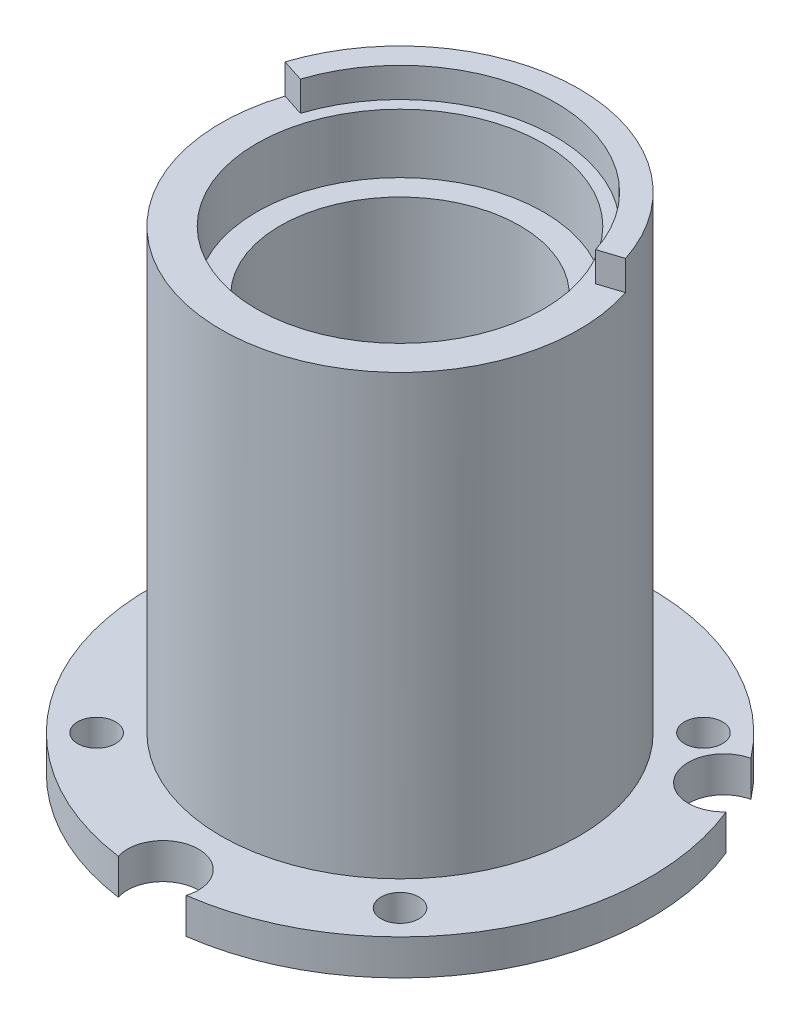
ISO-10303-21;
HEADER;
FILE_DESCRIPTION(('STEP AP214'),'2;1');
FILE_NAME('part.step','',(''),(''),'','','');
FILE_SCHEMA(('AUTOMOTIVE_DESIGN { 1 0 10303 214 1 1 1 1 }'));
ENDSEC;
DATA;
#1=APPLICATION_CONTEXT('core data for automotive mechanical design processes');
#2=APPLICATION_PROTOCOL_DEFINITION('international standard','automotive_design',2000,#1);
#3=PRODUCT_CONTEXT('',#1,'mechanical');
#4=PRODUCT('Part','Part','',(#3));
#5=PRODUCT_RELATED_PRODUCT_CATEGORY('part','',(#4));
#6=PRODUCT_DEFINITION_FORMATION('','',#4);
#7=PRODUCT_DEFINITION_CONTEXT('part definition',#1,'design');
#8=PRODUCT_DEFINITION('design','',#6,#7);
#9=PRODUCT_DEFINITION_SHAPE('','',#8);
#10=(LENGTH_UNIT() NAMED_UNIT(*) SI_UNIT(.MILLI.,.METRE.));
#11=(NAMED_UNIT(*) PLANE_ANGLE_UNIT() SI_UNIT($,.RADIAN.));
#12=(NAMED_UNIT(*) SI_UNIT($,.STERADIAN.) SOLID_ANGLE_UNIT());
#13=UNCERTAINTY_MEASURE_WITH_UNIT(LENGTH_MEASURE(1.E-05),#10,'distance_accuracy_value','');
#14=(GEOMETRIC_REPRESENTATION_CONTEXT(3) GLOBAL_UNCERTAINTY_ASSIGNED_CONTEXT((#13)) GLOBAL_UNIT_ASSIGNED_CONTEXT((#10,
#11,#12)) REPRESENTATION_CONTEXT('',''));
#15=CARTESIAN_POINT('',(0.,0.,0.));
#16=DIRECTION('',(0.,0.,1.));
#17=DIRECTION('',(1.,0.,0.));
#18=AXIS2_PLACEMENT_3D('',#15,#16,#17);
#19=CARTESIAN_POINT('',(0.,2.65658402047803,0.));
#20=DIRECTION('',(0.,-1.,0.));
#21=DIRECTION('',(0.,0.,-1.));
#22=AXIS2_PLACEMENT_3D('',#19,#20,#21);
#23=CYLINDRICAL_SURFACE('',#22,21.1);
#24=DIRECTION('',(0.,-1.,0.));
#25=VECTOR('',#24,1.);
#26=CARTESIAN_POINT('',(19.53455820284,1.15658402047804,-7.97565268926972));
#27=LINE('',#26,#25);
#28=CARTESIAN_POINT('',(19.53455820284,2.65658402047803,-7.97565268926972));
#29=VERTEX_POINT('',#28);
#30=CARTESIAN_POINT('',(19.53455820284,-0.343415979521965,-7.97565268926972));
#31=VERTEX_POINT('',#30);
#32=EDGE_CURVE('E225',#29,#31,#27,.T.);
#33=ORIENTED_EDGE('',*,*,#32,.F.);
#34=CARTESIAN_POINT('',(0.,2.65658402047803,0.));
#35=DIRECTION('',(0.,-1.,0.));
#36=DIRECTION('',(0.,0.,-1.));
#37=AXIS2_PLACEMENT_3D('',#34,#35,#36);
#38=CIRCLE('',#37,21.1);
#39=CARTESIAN_POINT('',(2.86016126075087,2.65658402047803,20.90525));
#40=VERTEX_POINT('',#39);
#41=EDGE_CURVE('E238',#29,#40,#38,.T.);
#42=ORIENTED_EDGE('',*,*,#41,.T.);
#43=DIRECTION('',(0.,-1.,0.));
#44=VECTOR('',#43,1.);
#45=CARTESIAN_POINT('',(2.86016126075087,1.15658402047804,20.90525));
#46=LINE('',#45,#44);
#47=CARTESIAN_POINT('',(2.86016126075087,-0.343415979521965,20.90525));
#48=VERTEX_POINT('',#47);
#49=EDGE_CURVE('E317',#48,#40,#46,.F.);
#50=ORIENTED_EDGE('',*,*,#49,.F.);
#51=CARTESIAN_POINT('',(0.,-0.343415979521965,0.));
#52=DIRECTION('',(0.,-1.,0.));
#53=DIRECTION('',(0.,0.,-1.));
#54=AXIS2_PLACEMENT_3D('',#51,#52,#53);
#55=CIRCLE('',#54,21.1);
#56=EDGE_CURVE('E236',#31,#48,#55,.T.);
#57=ORIENTED_EDGE('',*,*,#56,.F.);
#58=EDGE_LOOP('',(#33,#42,#50,#57));
#59=FACE_BOUND('',#58,.T.);
#60=ADVANCED_FACE('F36',(#59),#23,.T.);
#61=DIRECTION('',(0.,-1.,0.));
#62=VECTOR('',#61,1.);
#63=CARTESIAN_POINT('',(16.6743969420891,1.15658402047804,-12.9295973107305));
#64=LINE('',#63,#62);
#65=CARTESIAN_POINT('',(16.6743969420892,-0.343415979521965,-12.9295973107305));
#66=VERTEX_POINT('',#65);
#67=CARTESIAN_POINT('',(16.6743969420891,2.65658402047803,-12.9295973107305));
#68=VERTEX_POINT('',#67);
#69=EDGE_CURVE('E64',#66,#68,#64,.F.);
#70=ORIENTED_EDGE('',*,*,#69,.F.);
#71=CARTESIAN_POINT('',(-16.6743969420893,-0.343415979521965,-12.9295973107302));
#72=VERTEX_POINT('',#71);
#73=EDGE_CURVE('E222',#72,#66,#55,.T.);
#74=ORIENTED_EDGE('',*,*,#73,.F.);
#75=DIRECTION('',(0.,-1.,0.));
#76=VECTOR('',#75,1.);
#77=CARTESIAN_POINT('',(-16.6743969420893,1.15658402047804,-12.9295973107302));
#78=LINE('',#77,#76);
#79=CARTESIAN_POINT('',(-16.6743969420893,2.65658402047803,-12.9295973107302));
#80=VERTEX_POINT('',#79);
#81=EDGE_CURVE('E226',#80,#72,#78,.T.);
#82=ORIENTED_EDGE('',*,*,#81,.F.);
#83=EDGE_CURVE('E224',#80,#68,#38,.T.);
#84=ORIENTED_EDGE('',*,*,#83,.T.);
#85=EDGE_LOOP('',(#70,#74,#82,#84));
#86=FACE_BOUND('',#85,.T.);
#87=ADVANCED_FACE('F203',(#86),#23,.T.);
#88=CARTESIAN_POINT('',(0.,0.,0.));
#89=DIRECTION('',(0.,-1.,0.));
#90=DIRECTION('',(0.,0.,-1.));
#91=AXIS2_PLACEMENT_3D('',#88,#89,#90);
#92=CYLINDRICAL_SURFACE('',#91,15.1);
#93=CARTESIAN_POINT('',(0.,17.656584020478,-15.1));
#94=CARTESIAN_POINT('',(0.220562797228868,17.6565786750489,-15.0999966238633));
#95=CARTESIAN_POINT('',(0.441183132483683,17.6382798567774,-15.0951198010396));
#96=CARTESIAN_POINT('',(0.876071891674732,17.5656954460356,-15.0761386958318));
#97=CARTESIAN_POINT('',(1.09033714607183,17.5113922018138,-15.0620298873621));
#98=CARTESIAN_POINT('',(1.50617514769826,17.3686856431298,-15.0261426046077));
#99=CARTESIAN_POINT('',(1.70776375601984,17.2803259691262,-15.0043739488702));
#100=CARTESIAN_POINT('',(2.09326016244452,17.0721756463823,-14.9554694616101));
#101=CARTESIAN_POINT('',(2.27716684335126,16.9523830133957,-14.9283332912829));
#102=CARTESIAN_POINT('',(2.62629153686223,16.6818700668203,-14.8709302979056));
#103=CARTESIAN_POINT('',(2.7910468166787,16.5305637715842,-14.8406105216336));
#104=CARTESIAN_POINT('',(3.09316565387521,16.2025713913734,-14.7805988328791));
#105=CARTESIAN_POINT('',(3.23052573401469,16.0258820894538,-14.750907000528));
#106=CARTESIAN_POINT('',(3.47620253809525,15.6484566248968,-14.6949722039674));
#107=CARTESIAN_POINT('',(3.58398852405205,15.4473641730804,-14.6687960949846));
#108=CARTESIAN_POINT('',(3.76403958813345,15.0291063939305,-14.6236343764678));
#109=CARTESIAN_POINT('',(3.83631112002396,14.8119439951225,-14.6046474606416));
#110=CARTESIAN_POINT('',(3.94167778715528,14.3728315428059,-14.576560340708));
#111=CARTESIAN_POINT('',(3.97561113415321,14.1510964552699,-14.5672489746836));
#112=CARTESIAN_POINT('',(4.00595118006536,13.7049003167139,-14.5589362032035));
#113=CARTESIAN_POINT('',(4.00236479083902,13.4804397753848,-14.5599328988036));
#114=CARTESIAN_POINT('',(3.95843298520168,13.0416938773748,-14.5719345524567));
#115=CARTESIAN_POINT('',(3.91910014366665,12.827298392225,-14.5826638047186));
#116=CARTESIAN_POINT('',(3.80641301134432,12.4082636963053,-14.6124804248984));
#117=CARTESIAN_POINT('',(3.73305603348287,12.2036252575111,-14.6315684529485));
#118=CARTESIAN_POINT('',(3.55357376375817,11.8072659608455,-14.6761954710481));
#119=CARTESIAN_POINT('',(3.44709213251736,11.6157146271607,-14.701804034174));
#120=CARTESIAN_POINT('',(3.2046318404276,11.252842272732,-14.7565490797662));
#121=CARTESIAN_POINT('',(3.06864744253232,11.0815251967203,-14.7856862479101));
#122=CARTESIAN_POINT('',(2.76585698853845,10.7581972600255,-14.8453545463306));
#123=CARTESIAN_POINT('',(2.59820016759081,10.606984727798,-14.8759003668478));
#124=CARTESIAN_POINT('',(2.2395355744974,10.3346597206598,-14.9341032039872));
#125=CARTESIAN_POINT('',(2.04852690637947,10.2135484012245,-14.9617601096909));
#126=CARTESIAN_POINT('',(1.64735494607915,10.0045186452234,-15.0112353630004));
#127=CARTESIAN_POINT('',(1.43711390161777,9.91674306630125,-15.0330284681144));
#128=CARTESIAN_POINT('',(1.00415084879442,9.77801133205478,-15.0681380617388));
#129=CARTESIAN_POINT('',(0.781431541713066,9.72704724075199,-15.0814563772069));
#130=CARTESIAN_POINT('',(0.336648589961858,9.66463491426916,-15.0978401337941));
#131=CARTESIAN_POINT('',(0.114747418158932,9.65210109617539,-15.1011871654133));
#132=CARTESIAN_POINT('',(-0.327985783960883,9.66390936215301,-15.0980600007338));
#133=CARTESIAN_POINT('',(-0.54881792091589,9.68824768881771,-15.0915868051523));
#134=CARTESIAN_POINT('',(-0.979280958498657,9.77221844524353,-15.0697282484602));
#135=CARTESIAN_POINT('',(-1.18903815404239,9.8312468159492,-15.0544955129138));
#136=CARTESIAN_POINT('',(-1.59565379810279,9.9822218487114,-15.0168445095541));
#137=CARTESIAN_POINT('',(-1.79251085569912,10.074172053584,-14.9944254684283));
#138=CARTESIAN_POINT('',(-2.17196734475435,10.2904040196873,-14.9442272654636));
#139=CARTESIAN_POINT('',(-2.35421620717177,10.4152782516714,-14.9163525791196));
#140=CARTESIAN_POINT('',(-2.69555396198433,10.6930673707355,-14.8584659974154));
#141=CARTESIAN_POINT('',(-2.85463833151871,10.8459877206775,-14.8284536863834));
#142=CARTESIAN_POINT('',(-3.14969487480366,11.1805916761803,-14.7686408025333));
#143=CARTESIAN_POINT('',(-3.2849015729441,11.3629567234992,-14.7388693113288));
#144=CARTESIAN_POINT('',(-3.52280795028209,11.748415148171,-14.6838275580413));
#145=CARTESIAN_POINT('',(-3.62550899923424,11.9515076516131,-14.6585571063086));
#146=CARTESIAN_POINT('',(-3.79471564852268,12.3716322744878,-14.6156681753784));
#147=CARTESIAN_POINT('',(-3.86143167129966,12.5885748730149,-14.5980053358094));
#148=CARTESIAN_POINT('',(-3.95727897972285,13.0311458645033,-14.5723180037018));
#149=CARTESIAN_POINT('',(-3.98641971598772,13.2567720587317,-14.5642910876521));
#150=CARTESIAN_POINT('',(-4.0057509564332,13.7024738826508,-14.5589849799272));
#151=CARTESIAN_POINT('',(-3.99717101126322,13.9224929484877,-14.5613664977636));
#152=CARTESIAN_POINT('',(-3.94415242586916,14.3578266146844,-14.5758156252151));
#153=CARTESIAN_POINT('',(-3.89971468541121,14.5731413329494,-14.5878829917868));
#154=CARTESIAN_POINT('',(-3.7769504021145,14.9914297358991,-14.6201435430727));
#155=CARTESIAN_POINT('',(-3.69888114636745,15.1944840306692,-14.6402749559693));
#156=CARTESIAN_POINT('',(-3.5112700793988,15.5847652711898,-14.6863975339598));
#157=CARTESIAN_POINT('',(-3.40172339130457,15.7719897585691,-14.7123896069253));
#158=CARTESIAN_POINT('',(-3.15052672029905,16.1311736871732,-14.7682486052373));
#159=CARTESIAN_POINT('',(-3.00803614515793,16.302531234387,-14.7982062005284));
#160=CARTESIAN_POINT('',(-2.69659944290673,16.6193026739848,-14.8581107114785));
#161=CARTESIAN_POINT('',(-2.52764691014028,16.7647102663717,-14.8880576227874));
#162=CARTESIAN_POINT('',(-2.16379570375656,17.028456836261,-14.9453193069395));
#163=CARTESIAN_POINT('',(-1.96842619428846,17.1461624119047,-14.9725655002333));
#164=CARTESIAN_POINT('',(-1.55995870871917,17.3468733196659,-15.020608726219));
#165=CARTESIAN_POINT('',(-1.34687236272951,17.4299012034422,-15.0414099479367));
#166=CARTESIAN_POINT('',(-0.945442676396226,17.5479067890382,-15.071487392601));
#167=CARTESIAN_POINT('',(-0.758850172769467,17.5885668187228,-15.0821021944137));
#168=CARTESIAN_POINT('',(-0.381519195908572,17.6429064515397,-15.0963596236697));
#169=CARTESIAN_POINT('',(-0.190781122363445,17.6565886441362,-15.100002920271));
#170=CARTESIAN_POINT('',(0.,17.656584020478,-15.1));
#171=B_SPLINE_CURVE_WITH_KNOTS('',3,(#93,#94,#95,#96,#97,#98,#99,#100,#101,#102,#103,#104,#105,
#106,#107,#108,#109,#110,#111,#112,#113,#114,#115,#116,#117,#118,#119,#120,#121,#122,#123,#124,
#125,#126,#127,#128,#129,#130,#131,#132,#133,#134,#135,#136,#137,#138,#139,#140,#141,#142,#143,
#144,#145,#146,#147,#148,#149,#150,#151,#152,#153,#154,#155,#156,#157,#158,#159,#160,#161,#162,
#163,#164,#165,#166,#167,#168,#169,#170),.UNSPECIFIED.,.T.,.F.,(4,2,2,2,2,2,2,2,2,2,2,2,2,2,2,2,
2,2,2,2,2,2,2,2,2,2,2,2,2,2,2,2,2,2,2,2,2,2,4),(0.,0.660988802989895,1.32230190627698,
1.98277039462017,2.64328058592665,3.31738983245553,3.99158458850126,4.67718672131108,
5.36266421885425,6.03284569136863,6.70290370569758,7.35455344758097,8.00625466261243,
8.66522428460318,9.32432216348579,10.0046221332668,10.6849482132409,11.3681577332155,
12.0512199199534,12.7148003446971,13.3783131527119,14.030600883718,14.6829588304467,
15.3479690046623,16.0131088483216,16.6967397836718,17.3803419076818,18.0599020965825,
18.7392913348854,19.3967022015975,20.0540965726597,20.7065486634951,21.3591018948226,
22.030622909036,22.7023067305588,23.3881128403271,24.0734722583726,24.6452653854746,
25.217003626413),.UNSPECIFIED.);
#172=CARTESIAN_POINT('',(0.,17.656584020478,-15.1));
#173=VERTEX_POINT('',#172);
#174=EDGE_CURVE('E145',#173,#173,#171,.T.);
#175=ORIENTED_EDGE('',*,*,#174,.F.);
#176=EDGE_LOOP('',(#175));
#177=FACE_BOUND('',#176,.T.);
#178=CARTESIAN_POINT('',(0.,39.656584020478,0.));
#179=DIRECTION('',(0.,-1.,0.));
#180=DIRECTION('',(0.,0.,-1.));
#181=AXIS2_PLACEMENT_3D('',#178,#179,#180);
#182=CIRCLE('',#181,15.1);
#183=CARTESIAN_POINT('',(14.3609533960568,39.656584020478,-4.66615661506167));
#184=VERTEX_POINT('',#183);
#185=CARTESIAN_POINT('',(-14.3609533960568,39.656584020478,-4.66615661506167));
#186=VERTEX_POINT('',#185);
#187=EDGE_CURVE('E244',#184,#186,#182,.T.);
#188=ORIENTED_EDGE('',*,*,#187,.T.);
#189=DIRECTION('',(0.,-1.,0.));
#190=VECTOR('',#189,1.);
#191=CARTESIAN_POINT('',(-14.3609533960568,42.156584020478,-4.66615661506167));
#192=LINE('',#191,#190);
#193=CARTESIAN_POINT('',(-14.3609533960568,42.156584020478,-4.66615661506167));
#194=VERTEX_POINT('',#193);
#195=EDGE_CURVE('E56',#194,#186,#192,.T.);
#196=ORIENTED_EDGE('',*,*,#195,.F.);
#197=CARTESIAN_POINT('',(0.,42.156584020478,0.));
#198=DIRECTION('',(0.,1.,0.));
#199=DIRECTION('',(0.,0.,1.));
#200=AXIS2_PLACEMENT_3D('',#197,#198,#199);
#201=CIRCLE('',#200,15.1);
#202=CARTESIAN_POINT('',(14.3609533960568,42.156584020478,-4.66615661506167));
#203=VERTEX_POINT('',#202);
#204=EDGE_CURVE('E118',#203,#194,#201,.T.);
#205=ORIENTED_EDGE('',*,*,#204,.F.);
#206=DIRECTION('',(0.,-1.,0.));
#207=VECTOR('',#206,1.);
#208=CARTESIAN_POINT('',(14.3609533960568,42.156584020478,-4.66615661506167));
#209=LINE('',#208,#207);
#210=EDGE_CURVE('E124',#203,#184,#209,.T.);
#211=ORIENTED_EDGE('',*,*,#210,.T.);
#212=EDGE_LOOP('',(#188,#196,#205,#211));
#213=FACE_BOUND('',#212,.T.);
#214=CARTESIAN_POINT('',(0.,2.65658402047803,0.));
#215=DIRECTION('',(0.,-1.,0.));
#216=DIRECTION('',(0.,0.,-1.));
#217=AXIS2_PLACEMENT_3D('',#214,#215,#216);
#218=CIRCLE('',#217,15.1);
#219=CARTESIAN_POINT('',(0.,2.65658402047803,-15.1));
#220=VERTEX_POINT('',#219);
#221=EDGE_CURVE('E239',#220,#220,#218,.T.);
#222=ORIENTED_EDGE('',*,*,#221,.F.);
#223=EDGE_LOOP('',(#222));
#224=FACE_BOUND('',#223,.T.);
#225=ADVANCED_FACE('F121',(#177,#213,#224),#92,.T.);
#226=CARTESIAN_POINT('',(15.1,-0.343415979521965,0.));
#227=DIRECTION('',(0.,-1.,0.));
#228=DIRECTION('',(0.,0.,-1.));
#229=AXIS2_PLACEMENT_3D('',#226,#227,#228);
#230=PLANE('',#229);
#231=CARTESIAN_POINT('',(17.3205080756887,-0.343415979521965,-10.0000000000001));
#232=DIRECTION('',(0.,-1.,0.));
#233=DIRECTION('',(0.,0.,-1.));
#234=AXIS2_PLACEMENT_3D('',#231,#232,#233);
#235=CIRCLE('',#234,3.);
#236=EDGE_CURVE('E232',#31,#66,#235,.T.);
#237=ORIENTED_EDGE('',*,*,#236,.F.);
#238=ORIENTED_EDGE('',*,*,#56,.T.);
#239=CARTESIAN_POINT('',(0.,-0.343415979521965,20.));
#240=DIRECTION('',(0.,-1.,0.));
#241=DIRECTION('',(0.,0.,-1.));
#242=AXIS2_PLACEMENT_3D('',#239,#240,#241);
#243=CIRCLE('',#242,3.);
#244=CARTESIAN_POINT('',(-2.86016126075087,-0.343415979521965,20.90525));
#245=VERTEX_POINT('',#244);
#246=EDGE_CURVE('E314',#245,#48,#243,.T.);
#247=ORIENTED_EDGE('',*,*,#246,.F.);
#248=CARTESIAN_POINT('',(-19.5345582028402,-0.343415979521965,-7.97565268926945));
#249=VERTEX_POINT('',#248);
#250=EDGE_CURVE('E235',#245,#249,#55,.T.);
#251=ORIENTED_EDGE('',*,*,#250,.T.);
#252=CARTESIAN_POINT('',(-17.3205080756889,-0.343415979521965,-9.99999999999984));
#253=DIRECTION('',(0.,-1.,0.));
#254=DIRECTION('',(0.,0.,-1.));
#255=AXIS2_PLACEMENT_3D('',#252,#253,#254);
#256=CIRCLE('',#255,3.);
#257=EDGE_CURVE('E155',#72,#249,#256,.T.);
#258=ORIENTED_EDGE('',*,*,#257,.F.);
#259=ORIENTED_EDGE('',*,*,#73,.T.);
#260=EDGE_LOOP('',(#237,#238,#247,#251,#258,#259));
#261=FACE_BOUND('',#260,.T.);
#262=CARTESIAN_POINT('',(0.,-0.343415979521965,0.));
#263=DIRECTION('',(0.,-1.,0.));
#264=DIRECTION('',(0.,0.,-1.));
#265=AXIS2_PLACEMENT_3D('',#262,#263,#264);
#266=CIRCLE('',#265,12.1);
#267=CARTESIAN_POINT('',(0.,-0.343415979521965,-12.1));
#268=VERTEX_POINT('',#267);
#269=EDGE_CURVE('E49',#268,#268,#266,.T.);
#270=ORIENTED_EDGE('',*,*,#269,.F.);
#271=EDGE_LOOP('',(#270));
#272=FACE_BOUND('',#271,.T.);
#273=CARTESIAN_POINT('',(-12.7986327394765,-0.343415979521965,-12.7986327394765));
#274=DIRECTION('',(0.,-1.,0.));
#275=DIRECTION('',(0.,0.,-1.));
#276=AXIS2_PLACEMENT_3D('',#273,#274,#275);
#277=CIRCLE('',#276,1.6);
#278=CARTESIAN_POINT('',(-12.7986327394765,-0.343415979521965,-14.3986327394765));
#279=VERTEX_POINT('',#278);
#280=EDGE_CURVE('E271',#279,#279,#277,.T.);
#281=ORIENTED_EDGE('',*,*,#280,.F.);
#282=EDGE_LOOP('',(#281));
#283=FACE_BOUND('',#282,.T.);
#284=CARTESIAN_POINT('',(12.7986327394765,-0.343415979521965,-12.7986327394765));
#285=DIRECTION('',(0.,-1.,0.));
#286=DIRECTION('',(0.,0.,-1.));
#287=AXIS2_PLACEMENT_3D('',#284,#285,#286);
#288=CIRCLE('',#287,1.6);
#289=CARTESIAN_POINT('',(12.7986327394765,-0.343415979521965,-14.3986327394765));
#290=VERTEX_POINT('',#289);
#291=EDGE_CURVE('E275',#290,#290,#288,.T.);
#292=ORIENTED_EDGE('',*,*,#291,.F.);
#293=EDGE_LOOP('',(#292));
#294=FACE_BOUND('',#293,.T.);
#295=CARTESIAN_POINT('',(12.7986327394765,-0.343415979521965,12.7986327394765));
#296=DIRECTION('',(0.,-1.,0.));
#297=DIRECTION('',(0.,0.,-1.));
#298=AXIS2_PLACEMENT_3D('',#295,#296,#297);
#299=CIRCLE('',#298,1.6);
#300=CARTESIAN_POINT('',(12.7986327394765,-0.343415979521965,11.1986327394765));
#301=VERTEX_POINT('',#300);
#302=EDGE_CURVE('E279',#301,#301,#299,.T.);
#303=ORIENTED_EDGE('',*,*,#302,.F.);
#304=EDGE_LOOP('',(#303));
#305=FACE_BOUND('',#304,.T.);
#306=CARTESIAN_POINT('',(-12.7986327394765,-0.343415979521965,12.7986327394765));
#307=DIRECTION('',(0.,-1.,0.));
#308=DIRECTION('',(0.,0.,-1.));
#309=AXIS2_PLACEMENT_3D('',#306,#307,#308);
#310=CIRCLE('',#309,1.6);
#311=CARTESIAN_POINT('',(-12.7986327394765,-0.343415979521965,11.1986327394765));
#312=VERTEX_POINT('',#311);
#313=EDGE_CURVE('E282',#312,#312,#310,.T.);
#314=ORIENTED_EDGE('',*,*,#313,.F.);
#315=EDGE_LOOP('',(#314));
#316=FACE_BOUND('',#315,.T.);
#317=ADVANCED_FACE('F38',(#261,#272,#283,#294,#305,#316),#230,.T.);
#318=CARTESIAN_POINT('',(0.,0.,0.));
#319=DIRECTION('',(0.,-1.,0.));
#320=DIRECTION('',(0.,0.,-1.));
#321=AXIS2_PLACEMENT_3D('',#318,#319,#320);
#322=CYLINDRICAL_SURFACE('',#321,12.1);
#323=ORIENTED_EDGE('',*,*,#269,.T.);
#324=EDGE_LOOP('',(#323));
#325=FACE_BOUND('',#324,.T.);
#326=CARTESIAN_POINT('',(0.,4.65658402047803,0.));
#327=DIRECTION('',(0.,-1.,0.));
#328=DIRECTION('',(0.,0.,-1.));
#329=AXIS2_PLACEMENT_3D('',#326,#327,#328);
#330=CIRCLE('',#329,12.1);
#331=CARTESIAN_POINT('',(0.,4.65658402047803,-12.1));
#332=VERTEX_POINT('',#331);
#333=EDGE_CURVE('E258',#332,#332,#330,.T.);
#334=ORIENTED_EDGE('',*,*,#333,.F.);
#335=EDGE_LOOP('',(#334));
#336=FACE_BOUND('',#335,.T.);
#337=ADVANCED_FACE('F264',(#325,#336),#322,.F.);
#338=CARTESIAN_POINT('',(12.1,4.65658402047803,0.));
#339=DIRECTION('',(0.,-1.,0.));
#340=DIRECTION('',(0.,0.,-1.));
#341=AXIS2_PLACEMENT_3D('',#338,#339,#340);
#342=PLANE('',#341);
#343=ORIENTED_EDGE('',*,*,#333,.T.);
#344=EDGE_LOOP('',(#343));
#345=FACE_BOUND('',#344,.T.);
#346=CARTESIAN_POINT('',(0.,4.65658402047803,0.));
#347=DIRECTION('',(0.,-1.,0.));
#348=DIRECTION('',(0.,0.,-1.));
#349=AXIS2_PLACEMENT_3D('',#346,#347,#348);
#350=CIRCLE('',#349,10.1);
#351=CARTESIAN_POINT('',(0.,4.65658402047803,-10.1));
#352=VERTEX_POINT('',#351);
#353=EDGE_CURVE('E255',#352,#352,#350,.T.);
#354=ORIENTED_EDGE('',*,*,#353,.F.);
#355=EDGE_LOOP('',(#354));
#356=FACE_BOUND('',#355,.T.);
#357=ADVANCED_FACE('F341',(#345,#356),#342,.T.);
#358=CARTESIAN_POINT('',(0.,0.,0.));
#359=DIRECTION('',(0.,-1.,0.));
#360=DIRECTION('',(0.,0.,-1.));
#361=AXIS2_PLACEMENT_3D('',#358,#359,#360);
#362=CYLINDRICAL_SURFACE('',#361,10.1);
#363=CARTESIAN_POINT('',(0.,17.656584020478,-10.1));
#364=CARTESIAN_POINT('',(-0.107647144701604,17.6565832587065,-10.0999994075913));
#365=CARTESIAN_POINT('',(-0.215328676820388,17.6522326428667,-10.0982742068914));
#366=CARTESIAN_POINT('',(-0.429927290763231,17.6348707345046,-10.0914173398427));
#367=CARTESIAN_POINT('',(-0.536843860974989,17.6218541100986,-10.0862835763329));
#368=CARTESIAN_POINT('',(-0.749299254797618,17.5872518677446,-10.0727301870801));
#369=CARTESIAN_POINT('',(-0.854834904544398,17.5656492077402,-10.0643040269647));
#370=CARTESIAN_POINT('',(-1.06356598295805,17.5140971050026,-10.0443940427747));
#371=CARTESIAN_POINT('',(-1.16676044401174,17.4841442767367,-10.0329089785675));
#372=CARTESIAN_POINT('',(-1.47102510132135,17.382387539436,-9.99437885965602));
#373=CARTESIAN_POINT('',(-1.66769380266467,17.2985336960561,-9.96319656518474));
#374=CARTESIAN_POINT('',(-2.04390806402609,17.1015244616651,-9.89288591613039));
#375=CARTESIAN_POINT('',(-2.22345871066584,16.9883778123618,-9.85375993289359));
#376=CARTESIAN_POINT('',(-2.56903329713283,16.7304203542717,-9.76949344124527));
#377=CARTESIAN_POINT('',(-2.7341661803382,16.5844744450589,-9.72416875174063));
#378=CARTESIAN_POINT('',(-3.03835422673372,16.2674667620212,-9.63346561319454));
#379=CARTESIAN_POINT('',(-3.17739724877115,16.0963933605828,-9.58808714896442));
#380=CARTESIAN_POINT('',(-3.43141557169078,15.7249541436789,-9.50022416003364));
#381=CARTESIAN_POINT('',(-3.54508298376939,15.5236386837546,-9.45795098029275));
#382=CARTESIAN_POINT('',(-3.73654503757433,15.1028197780446,-9.38396753439343));
#383=CARTESIAN_POINT('',(-3.81435626123015,14.8833247950157,-9.35225238749086));
#384=CARTESIAN_POINT('',(-3.92830517347527,14.4426281922986,-9.30494992198666));
#385=CARTESIAN_POINT('',(-3.96614933226634,14.2219408999642,-9.28870538959904));
#386=CARTESIAN_POINT('',(-4.00442119760233,13.7767965967266,-9.27227533300386));
#387=CARTESIAN_POINT('',(-4.00486682895104,13.5523414433256,-9.27208211553475));
#388=CARTESIAN_POINT('',(-3.96962419992357,13.1223000338954,-9.28721486205585));
#389=CARTESIAN_POINT('',(-3.93639038969555,12.9164683816211,-9.30148667021066));
#390=CARTESIAN_POINT('',(-3.83881908781008,12.5135858587755,-9.34217492215623));
#391=CARTESIAN_POINT('',(-3.77447628493772,12.3165364938742,-9.36859343970778));
#392=CARTESIAN_POINT('',(-3.6152973991123,11.932114782097,-9.43117373854993));
#393=CARTESIAN_POINT('',(-3.51987199599564,11.745018068667,-9.46752143275806));
#394=CARTESIAN_POINT('',(-3.30164990187873,11.3888152139714,-9.5458117568267));
#395=CARTESIAN_POINT('',(-3.17884305932242,11.219715779563,-9.58775645943324));
#396=CARTESIAN_POINT('',(-2.89842155842441,10.8908470737452,-9.67638025391327));
#397=CARTESIAN_POINT('',(-2.73887655730999,10.732751254975,-9.72317746146031));
#398=CARTESIAN_POINT('',(-2.39503296315178,10.445029835027,-9.81353088527905));
#399=CARTESIAN_POINT('',(-2.21072964289325,10.3154096833197,-9.85708648014125));
#400=CARTESIAN_POINT('',(-1.81793239918158,10.0861811659207,-9.93710191289546));
#401=CARTESIAN_POINT('',(-1.60904499419909,9.98719061733374,-9.97341100737685));
#402=CARTESIAN_POINT('',(-1.17578068140001,9.82632769708926,-10.0337063781763));
#403=CARTESIAN_POINT('',(-0.951411543600234,9.76443685466008,-10.0576987857278));
#404=CARTESIAN_POINT('',(-0.507589198390038,9.68288739934039,-10.0895464914259));
#405=CARTESIAN_POINT('',(-0.288610703190693,9.6609791437004,-10.0982602217395));
#406=CARTESIAN_POINT('',(0.150045255448021,9.65338901030478,-10.101264516192));
#407=CARTESIAN_POINT('',(0.369722528063078,9.66769797007533,-10.0955587282778));
#408=CARTESIAN_POINT('',(0.79342076821632,9.73047250042779,-10.0709278727436));
#409=CARTESIAN_POINT('',(0.9977058372372,9.77741252435455,-10.0525935446905));
#410=CARTESIAN_POINT('',(1.3953191839645,9.90205187728631,-10.0051588533278));
#411=CARTESIAN_POINT('',(1.58864604661708,9.97975516851242,-9.97605710323661));
#412=CARTESIAN_POINT('',(1.96547076688218,10.1662450818711,-9.90881876512716));
#413=CARTESIAN_POINT('',(2.14849043013398,10.2759057152939,-9.87043416787036));
#414=CARTESIAN_POINT('',(2.49416936997082,10.5222251032553,-9.78880564505308));
#415=CARTESIAN_POINT('',(2.65682053561614,10.6588945574792,-9.74555979661966));
#416=CARTESIAN_POINT('',(2.9681866039024,10.9657340356335,-9.65545563666606));
#417=CARTESIAN_POINT('',(3.11531764917981,11.137500027155,-9.6085447040502));
#418=CARTESIAN_POINT('',(3.37904403285426,11.5041301146256,-9.51900784116495));
#419=CARTESIAN_POINT('',(3.49563475436564,11.698997696461,-9.47638255937157));
#420=CARTESIAN_POINT('',(3.69559846919336,12.1090072876214,-9.40022112370453));
#421=CARTESIAN_POINT('',(3.77867332647537,12.3243110867901,-9.36676735998193));
#422=CARTESIAN_POINT('',(3.90676060265477,12.7675723169603,-9.31408126060452));
#423=CARTESIAN_POINT('',(3.95180034236561,12.9955205397673,-9.29483871820763));
#424=CARTESIAN_POINT('',(3.99995361587901,13.4402225374874,-9.27421119996066));
#425=CARTESIAN_POINT('',(4.00580792366179,13.6566273435989,-9.27165914480348));
#426=CARTESIAN_POINT('',(3.98259310374,14.0871786302774,-9.28165454913205));
#427=CARTESIAN_POINT('',(3.95352819829609,14.3013253807193,-9.29420018307932));
#428=CARTESIAN_POINT('',(3.86352208144693,14.7129564516723,-9.33195705941984));
#429=CARTESIAN_POINT('',(3.80383400045007,14.910764715031,-9.35666894831213));
#430=CARTESIAN_POINT('',(3.65543747041438,15.293643395226,-9.41563163321061));
#431=CARTESIAN_POINT('',(3.5667213417057,15.4787104255375,-9.44988495314401));
#432=CARTESIAN_POINT('',(3.35699042203066,15.8422436354538,-9.52647530501455));
#433=CARTESIAN_POINT('',(3.23443392954221,16.0197460482676,-9.56915972741445));
#434=CARTESIAN_POINT('',(2.96277100517629,16.3525376288345,-9.65672519330708));
#435=CARTESIAN_POINT('',(2.81365510853323,16.5078188421,-9.70160701572183));
#436=CARTESIAN_POINT('',(2.48188367729514,16.8018022387985,-9.79191427568131));
#437=CARTESIAN_POINT('',(2.29770451316421,16.9388375571067,-9.83719496524673));
#438=CARTESIAN_POINT('',(1.90733970158921,17.1800342059545,-9.92027458794453));
#439=CARTESIAN_POINT('',(1.70115128023153,17.2841913861707,-9.95807257628478));
#440=CARTESIAN_POINT('',(1.29059703259214,17.4485351629562,-10.0191596219846));
#441=CARTESIAN_POINT('',(1.08758942542805,17.5117251091616,-10.0434145037657));
#442=CARTESIAN_POINT('',(0.777160121481599,17.5817972790842,-10.0705946985765));
#443=CARTESIAN_POINT('',(0.672781005614759,17.6010304889349,-10.0781187866848));
#444=CARTESIAN_POINT('',(0.462662729191936,17.6311505936905,-10.0899442727308));
#445=CARTESIAN_POINT('',(0.356924404717163,17.642042391187,-10.0942475636298));
#446=CARTESIAN_POINT('',(0.209157259717572,17.6513314925038,-10.0979207930228));
#447=CARTESIAN_POINT('',(0.167356987028204,17.6533005380261,-10.0986999952367));
#448=CARTESIAN_POINT('',(0.0837062109511403,17.6559269868629,-10.0997397284297));
#449=CARTESIAN_POINT('',(0.0418557048799863,17.6565843166725,-10.1000002303422));
#450=CARTESIAN_POINT('',(0.,17.656584020478,-10.1));
#451=B_SPLINE_CURVE_WITH_KNOTS('',3,(#363,#364,#365,#366,#367,#368,#369,#370,#371,#372,#373,
#374,#375,#376,#377,#378,#379,#380,#381,#382,#383,#384,#385,#386,#387,#388,#389,#390,#391,#392,
#393,#394,#395,#396,#397,#398,#399,#400,#401,#402,#403,#404,#405,#406,#407,#408,#409,#410,#411,
#412,#413,#414,#415,#416,#417,#418,#419,#420,#421,#422,#423,#424,#425,#426,#427,#428,#429,#430,
#431,#432,#433,#434,#435,#436,#437,#438,#439,#440,#441,#442,#443,#444,#445,#446,#447,#448,#449,
#450),.UNSPECIFIED.,.T.,.F.,(4,2,2,2,2,2,2,2,2,2,2,2,2,2,2,2,2,2,2,2,2,2,2,2,2,2,2,2,2,2,2,2,2,
2,2,2,2,2,2,2,2,2,2,4),(0.,0.322899105002489,0.645997062048508,0.969739550991452,
1.29361349104033,1.93860139021885,2.58339703026546,3.25541380545629,3.92774253831422,
4.62927738276715,5.33048747143541,6.00037089859498,6.66993325435359,7.29397639320695,
7.91812611211829,8.55487493671007,9.19186022701685,9.87703131723022,10.5623334166101,
11.2606719524815,11.9586625182623,12.6160028090057,13.2731768180207,13.9015288161875,
14.5299617706415,15.1775202673736,15.8253358139017,16.5150892569116,17.2049469122194,
17.9008125343287,18.5961778865195,19.2423472324951,19.8884384546934,20.509980844118,
21.1316878021367,21.788522073208,22.4455908851704,23.1441653918441,23.84282804681,
24.4816139215938,24.8005102549856,25.1192190157227,25.2447626369063,25.3703132930101),.UNSPECIFIED.);
#452=CARTESIAN_POINT('',(0.,17.656584020478,-10.1));
#453=VERTEX_POINT('',#452);
#454=EDGE_CURVE('E40',#453,#453,#451,.T.);
#455=ORIENTED_EDGE('',*,*,#454,.F.);
#456=EDGE_LOOP('',(#455));
#457=FACE_BOUND('',#456,.T.);
#458=ORIENTED_EDGE('',*,*,#353,.T.);
#459=EDGE_LOOP('',(#458));
#460=FACE_BOUND('',#459,.T.);
#461=CARTESIAN_POINT('',(0.,34.656584020478,0.));
#462=DIRECTION('',(0.,-1.,0.));
#463=DIRECTION('',(0.,0.,-1.));
#464=AXIS2_PLACEMENT_3D('',#461,#462,#463);
#465=CIRCLE('',#464,10.1);
#466=CARTESIAN_POINT('',(0.,34.656584020478,-10.1));
#467=VERTEX_POINT('',#466);
#468=EDGE_CURVE('E252',#467,#467,#465,.T.);
#469=ORIENTED_EDGE('',*,*,#468,.F.);
#470=EDGE_LOOP('',(#469));
#471=FACE_BOUND('',#470,.T.);
#472=ADVANCED_FACE('F345',(#457,#460,#471),#362,.F.);
#473=CARTESIAN_POINT('',(10.1,34.656584020478,0.));
#474=DIRECTION('',(0.,1.,0.));
#475=DIRECTION('',(0.,0.,1.));
#476=AXIS2_PLACEMENT_3D('',#473,#474,#475);
#477=PLANE('',#476);
#478=ORIENTED_EDGE('',*,*,#468,.T.);
#479=EDGE_LOOP('',(#478));
#480=FACE_BOUND('',#479,.T.);
#481=CARTESIAN_POINT('',(0.,34.656584020478,0.));
#482=DIRECTION('',(0.,-1.,0.));
#483=DIRECTION('',(0.,0.,-1.));
#484=AXIS2_PLACEMENT_3D('',#481,#482,#483);
#485=CIRCLE('',#484,12.1);
#486=CARTESIAN_POINT('',(0.,34.656584020478,-12.1));
#487=VERTEX_POINT('',#486);
#488=EDGE_CURVE('E249',#487,#487,#485,.T.);
#489=ORIENTED_EDGE('',*,*,#488,.F.);
#490=EDGE_LOOP('',(#489));
#491=FACE_BOUND('',#490,.T.);
#492=ADVANCED_FACE('F351',(#480,#491),#477,.T.);
#493=CARTESIAN_POINT('',(0.,0.,0.));
#494=DIRECTION('',(0.,-1.,0.));
#495=DIRECTION('',(0.,0.,-1.));
#496=AXIS2_PLACEMENT_3D('',#493,#494,#495);
#497=CYLINDRICAL_SURFACE('',#496,12.1);
#498=ORIENTED_EDGE('',*,*,#488,.T.);
#499=EDGE_LOOP('',(#498));
#500=FACE_BOUND('',#499,.T.);
#501=CARTESIAN_POINT('',(0.,39.656584020478,0.));
#502=DIRECTION('',(0.,-1.,0.));
#503=DIRECTION('',(0.,0.,-1.));
#504=AXIS2_PLACEMENT_3D('',#501,#502,#503);
#505=CIRCLE('',#504,12.1);
#506=CARTESIAN_POINT('',(0.,39.656584020478,-12.1));
#507=VERTEX_POINT('',#506);
#508=EDGE_CURVE('E246',#507,#507,#505,.T.);
#509=ORIENTED_EDGE('',*,*,#508,.F.);
#510=EDGE_LOOP('',(#509));
#511=FACE_BOUND('',#510,.T.);
#512=ADVANCED_FACE('F207',(#500,#511),#497,.F.);
#513=CARTESIAN_POINT('',(12.1,39.656584020478,0.));
#514=DIRECTION('',(0.,1.,0.));
#515=DIRECTION('',(0.,0.,1.));
#516=AXIS2_PLACEMENT_3D('',#513,#514,#515);
#517=PLANE('',#516);
#518=DIRECTION('',(0.951056516295155,0.,-0.309016994374945));
#519=VECTOR('',#518,1.);
#520=CARTESIAN_POINT('',(12.4588403634665,39.656584020478,-4.04812262631178));
#521=LINE('',#520,#519);
#522=CARTESIAN_POINT('',(12.4588403634665,39.656584020478,-4.04812262631178));
#523=VERTEX_POINT('',#522);
#524=EDGE_CURVE('E141',#523,#184,#521,.T.);
#525=ORIENTED_EDGE('',*,*,#524,.F.);
#526=CARTESIAN_POINT('',(0.,39.656584020478,0.));
#527=DIRECTION('',(0.,1.,0.));
#528=DIRECTION('',(0.,0.,1.));
#529=AXIS2_PLACEMENT_3D('',#526,#527,#528);
#530=CIRCLE('',#529,13.1);
#531=CARTESIAN_POINT('',(-12.4588403634665,39.656584020478,-4.04812262631178));
#532=VERTEX_POINT('',#531);
#533=EDGE_CURVE('E137',#523,#532,#530,.T.);
#534=ORIENTED_EDGE('',*,*,#533,.T.);
#535=DIRECTION('',(-0.951056516295154,0.,-0.309016994374945));
#536=VECTOR('',#535,1.);
#537=CARTESIAN_POINT('',(-12.4588403634665,39.656584020478,-4.04812262631178));
#538=LINE('',#537,#536);
#539=EDGE_CURVE('E418',#532,#186,#538,.T.);
#540=ORIENTED_EDGE('',*,*,#539,.T.);
#541=ORIENTED_EDGE('',*,*,#187,.F.);
#542=EDGE_LOOP('',(#525,#534,#540,#541));
#543=FACE_BOUND('',#542,.T.);
#544=ORIENTED_EDGE('',*,*,#508,.T.);
#545=EDGE_LOOP('',(#544));
#546=FACE_BOUND('',#545,.T.);
#547=ADVANCED_FACE('F201',(#543,#546),#517,.T.);
#548=DIRECTION('',(0.,-1.,0.));
#549=VECTOR('',#548,1.);
#550=CARTESIAN_POINT('',(-19.5345582028402,1.15658402047804,-7.97565268926945));
#551=LINE('',#550,#549);
#552=CARTESIAN_POINT('',(-19.5345582028402,2.65658402047803,-7.97565268926944));
#553=VERTEX_POINT('',#552);
#554=EDGE_CURVE('E304',#249,#553,#551,.F.);
#555=ORIENTED_EDGE('',*,*,#554,.F.);
#556=ORIENTED_EDGE('',*,*,#250,.F.);
#557=DIRECTION('',(0.,-1.,0.));
#558=VECTOR('',#557,1.);
#559=CARTESIAN_POINT('',(-2.86016126075087,1.15658402047804,20.90525));
#560=LINE('',#559,#558);
#561=CARTESIAN_POINT('',(-2.86016126075087,2.65658402047803,20.90525));
#562=VERTEX_POINT('',#561);
#563=EDGE_CURVE('E305',#562,#245,#560,.T.);
#564=ORIENTED_EDGE('',*,*,#563,.F.);
#565=EDGE_CURVE('E242',#562,#553,#38,.T.);
#566=ORIENTED_EDGE('',*,*,#565,.T.);
#567=EDGE_LOOP('',(#555,#556,#564,#566));
#568=FACE_BOUND('',#567,.T.);
#569=ADVANCED_FACE('F198',(#568),#23,.T.);
#570=CARTESIAN_POINT('',(0.,2.65658402047803,0.));
#571=DIRECTION('',(0.,-1.,0.));
#572=DIRECTION('',(0.,0.,-1.));
#573=AXIS2_PLACEMENT_3D('',#570,#571,#572);
#574=PLANE('',#573);
#575=CARTESIAN_POINT('',(-12.7986327394765,2.65658402047803,-12.7986327394765));
#576=DIRECTION('',(0.,-1.,0.));
#577=DIRECTION('',(0.,0.,-1.));
#578=AXIS2_PLACEMENT_3D('',#575,#576,#577);
#579=CIRCLE('',#578,1.6);
#580=CARTESIAN_POINT('',(-12.7986327394765,2.65658402047803,-14.3986327394765));
#581=VERTEX_POINT('',#580);
#582=EDGE_CURVE('E320',#581,#581,#579,.T.);
#583=ORIENTED_EDGE('',*,*,#582,.T.);
#584=EDGE_LOOP('',(#583));
#585=FACE_BOUND('',#584,.T.);
#586=CARTESIAN_POINT('',(12.7986327394765,2.65658402047803,-12.7986327394765));
#587=DIRECTION('',(0.,-1.,0.));
#588=DIRECTION('',(0.,0.,-1.));
#589=AXIS2_PLACEMENT_3D('',#586,#587,#588);
#590=CIRCLE('',#589,1.6);
#591=CARTESIAN_POINT('',(12.7986327394765,2.65658402047803,-14.3986327394765));
#592=VERTEX_POINT('',#591);
#593=EDGE_CURVE('E324',#592,#592,#590,.T.);
#594=ORIENTED_EDGE('',*,*,#593,.T.);
#595=EDGE_LOOP('',(#594));
#596=FACE_BOUND('',#595,.T.);
#597=CARTESIAN_POINT('',(12.7986327394765,2.65658402047803,12.7986327394765));
#598=DIRECTION('',(0.,-1.,0.));
#599=DIRECTION('',(0.,0.,-1.));
#600=AXIS2_PLACEMENT_3D('',#597,#598,#599);
#601=CIRCLE('',#600,1.6);
#602=CARTESIAN_POINT('',(12.7986327394765,2.65658402047803,11.1986327394765));
#603=VERTEX_POINT('',#602);
#604=EDGE_CURVE('E285',#603,#603,#601,.T.);
#605=ORIENTED_EDGE('',*,*,#604,.T.);
#606=EDGE_LOOP('',(#605));
#607=FACE_BOUND('',#606,.T.);
#608=CARTESIAN_POINT('',(-12.7986327394765,2.65658402047803,12.7986327394765));
#609=DIRECTION('',(0.,-1.,0.));
#610=DIRECTION('',(0.,0.,-1.));
#611=AXIS2_PLACEMENT_3D('',#608,#609,#610);
#612=CIRCLE('',#611,1.6);
#613=CARTESIAN_POINT('',(-12.7986327394765,2.65658402047803,11.1986327394765));
#614=VERTEX_POINT('',#613);
#615=EDGE_CURVE('E284',#614,#614,#612,.T.);
#616=ORIENTED_EDGE('',*,*,#615,.T.);
#617=EDGE_LOOP('',(#616));
#618=FACE_BOUND('',#617,.T.);
#619=ORIENTED_EDGE('',*,*,#221,.T.);
#620=EDGE_LOOP('',(#619));
#621=FACE_BOUND('',#620,.T.);
#622=ORIENTED_EDGE('',*,*,#41,.F.);
#623=CARTESIAN_POINT('',(17.3205080756887,2.65658402047803,-10.0000000000001));
#624=DIRECTION('',(0.,-1.,0.));
#625=DIRECTION('',(0.,0.,-1.));
#626=AXIS2_PLACEMENT_3D('',#623,#624,#625);
#627=CIRCLE('',#626,3.);
#628=EDGE_CURVE('E156',#29,#68,#627,.T.);
#629=ORIENTED_EDGE('',*,*,#628,.T.);
#630=ORIENTED_EDGE('',*,*,#83,.F.);
#631=CARTESIAN_POINT('',(-17.3205080756889,2.65658402047803,-9.99999999999984));
#632=DIRECTION('',(0.,-1.,0.));
#633=DIRECTION('',(0.,0.,-1.));
#634=AXIS2_PLACEMENT_3D('',#631,#632,#633);
#635=CIRCLE('',#634,3.);
#636=EDGE_CURVE('E307',#80,#553,#635,.T.);
#637=ORIENTED_EDGE('',*,*,#636,.T.);
#638=ORIENTED_EDGE('',*,*,#565,.F.);
#639=CARTESIAN_POINT('',(0.,2.65658402047803,20.));
#640=DIRECTION('',(0.,-1.,0.));
#641=DIRECTION('',(0.,0.,-1.));
#642=AXIS2_PLACEMENT_3D('',#639,#640,#641);
#643=CIRCLE('',#642,3.);
#644=EDGE_CURVE('E11',#562,#40,#643,.T.);
#645=ORIENTED_EDGE('',*,*,#644,.T.);
#646=EDGE_LOOP('',(#622,#629,#630,#637,#638,#645));
#647=FACE_BOUND('',#646,.T.);
#648=ADVANCED_FACE('F195',(#585,#596,#607,#618,#621,#647),#574,.F.);
#649=CARTESIAN_POINT('',(-12.7986327394765,2.65658402047803,12.7986327394765));
#650=DIRECTION('',(0.,-1.,0.));
#651=DIRECTION('',(0.,0.,-1.));
#652=AXIS2_PLACEMENT_3D('',#649,#650,#651);
#653=CYLINDRICAL_SURFACE('',#652,1.6);
#654=ORIENTED_EDGE('',*,*,#615,.F.);
#655=EDGE_LOOP('',(#654));
#656=FACE_BOUND('',#655,.T.);
#657=ORIENTED_EDGE('',*,*,#313,.T.);
#658=EDGE_LOOP('',(#657));
#659=FACE_BOUND('',#658,.T.);
#660=ADVANCED_FACE('F191',(#656,#659),#653,.F.);
#661=CARTESIAN_POINT('',(12.7986327394765,2.65658402047803,12.7986327394765));
#662=DIRECTION('',(0.,-1.,0.));
#663=DIRECTION('',(0.,0.,-1.));
#664=AXIS2_PLACEMENT_3D('',#661,#662,#663);
#665=CYLINDRICAL_SURFACE('',#664,1.6);
#666=ORIENTED_EDGE('',*,*,#604,.F.);
#667=EDGE_LOOP('',(#666));
#668=FACE_BOUND('',#667,.T.);
#669=ORIENTED_EDGE('',*,*,#302,.T.);
#670=EDGE_LOOP('',(#669));
#671=FACE_BOUND('',#670,.T.);
#672=ADVANCED_FACE('F187',(#668,#671),#665,.F.);
#673=CARTESIAN_POINT('',(12.7986327394765,2.65658402047803,-12.7986327394765));
#674=DIRECTION('',(0.,-1.,0.));
#675=DIRECTION('',(0.,0.,-1.));
#676=AXIS2_PLACEMENT_3D('',#673,#674,#675);
#677=CYLINDRICAL_SURFACE('',#676,1.6);
#678=ORIENTED_EDGE('',*,*,#593,.F.);
#679=EDGE_LOOP('',(#678));
#680=FACE_BOUND('',#679,.T.);
#681=ORIENTED_EDGE('',*,*,#291,.T.);
#682=EDGE_LOOP('',(#681));
#683=FACE_BOUND('',#682,.T.);
#684=ADVANCED_FACE('F183',(#680,#683),#677,.F.);
#685=CARTESIAN_POINT('',(-12.7986327394765,2.65658402047803,-12.7986327394765));
#686=DIRECTION('',(0.,-1.,0.));
#687=DIRECTION('',(0.,0.,-1.));
#688=AXIS2_PLACEMENT_3D('',#685,#686,#687);
#689=CYLINDRICAL_SURFACE('',#688,1.6);
#690=ORIENTED_EDGE('',*,*,#582,.F.);
#691=EDGE_LOOP('',(#690));
#692=FACE_BOUND('',#691,.T.);
#693=ORIENTED_EDGE('',*,*,#280,.T.);
#694=EDGE_LOOP('',(#693));
#695=FACE_BOUND('',#694,.T.);
#696=ADVANCED_FACE('F179',(#692,#695),#689,.F.);
#697=CARTESIAN_POINT('',(0.,2.65658402047803,20.));
#698=DIRECTION('',(0.,-1.,0.));
#699=DIRECTION('',(0.,0.,-1.));
#700=AXIS2_PLACEMENT_3D('',#697,#698,#699);
#701=CYLINDRICAL_SURFACE('',#700,3.);
#702=ORIENTED_EDGE('',*,*,#563,.T.);
#703=ORIENTED_EDGE('',*,*,#246,.T.);
#704=ORIENTED_EDGE('',*,*,#49,.T.);
#705=ORIENTED_EDGE('',*,*,#644,.F.);
#706=EDGE_LOOP('',(#702,#703,#704,#705));
#707=FACE_BOUND('',#706,.T.);
#708=ADVANCED_FACE('F175',(#707),#701,.F.);
#709=CARTESIAN_POINT('',(-17.3205080756889,2.65658402047803,-9.99999999999984));
#710=DIRECTION('',(0.,-1.,0.));
#711=DIRECTION('',(0.,0.,-1.));
#712=AXIS2_PLACEMENT_3D('',#709,#710,#711);
#713=CYLINDRICAL_SURFACE('',#712,3.);
#714=ORIENTED_EDGE('',*,*,#81,.T.);
#715=ORIENTED_EDGE('',*,*,#257,.T.);
#716=ORIENTED_EDGE('',*,*,#554,.T.);
#717=ORIENTED_EDGE('',*,*,#636,.F.);
#718=EDGE_LOOP('',(#714,#715,#716,#717));
#719=FACE_BOUND('',#718,.T.);
#720=ADVANCED_FACE('F172',(#719),#713,.F.);
#721=CARTESIAN_POINT('',(17.3205080756887,2.65658402047803,-10.0000000000001));
#722=DIRECTION('',(0.,-1.,0.));
#723=DIRECTION('',(0.,0.,-1.));
#724=AXIS2_PLACEMENT_3D('',#721,#722,#723);
#725=CYLINDRICAL_SURFACE('',#724,3.);
#726=ORIENTED_EDGE('',*,*,#32,.T.);
#727=ORIENTED_EDGE('',*,*,#236,.T.);
#728=ORIENTED_EDGE('',*,*,#69,.T.);
#729=ORIENTED_EDGE('',*,*,#628,.F.);
#730=EDGE_LOOP('',(#726,#727,#728,#729));
#731=FACE_BOUND('',#730,.T.);
#732=ADVANCED_FACE('F166',(#731),#725,.F.);
#733=CARTESIAN_POINT('',(0.,13.656584020478,-42.));
#734=DIRECTION('',(0.,0.,1.));
#735=DIRECTION('',(1.,0.,0.));
#736=AXIS2_PLACEMENT_3D('',#733,#734,#735);
#737=CYLINDRICAL_SURFACE('',#736,4.);
#738=ORIENTED_EDGE('',*,*,#174,.T.);
#739=EDGE_LOOP('',(#738));
#740=FACE_BOUND('',#739,.T.);
#741=ORIENTED_EDGE('',*,*,#454,.T.);
#742=EDGE_LOOP('',(#741));
#743=FACE_BOUND('',#742,.T.);
#744=ADVANCED_FACE('F161',(#740,#743),#737,.F.);
#745=CARTESIAN_POINT('',(12.4588403634665,42.156584020478,-4.04812262631178));
#746=DIRECTION('',(-0.309016994374945,0.,-0.951056516295155));
#747=DIRECTION('',(-0.951056516295155,0.,0.309016994374945));
#748=AXIS2_PLACEMENT_3D('',#745,#746,#747);
#749=PLANE('',#748);
#750=ORIENTED_EDGE('',*,*,#524,.T.);
#751=ORIENTED_EDGE('',*,*,#210,.F.);
#752=DIRECTION('',(0.951056516295155,0.,-0.309016994374945));
#753=VECTOR('',#752,1.);
#754=CARTESIAN_POINT('',(12.4588403634665,42.156584020478,-4.04812262631178));
#755=LINE('',#754,#753);
#756=CARTESIAN_POINT('',(12.4588403634665,42.156584020478,-4.04812262631178));
#757=VERTEX_POINT('',#756);
#758=EDGE_CURVE('E129',#757,#203,#755,.T.);
#759=ORIENTED_EDGE('',*,*,#758,.F.);
#760=DIRECTION('',(0.,-1.,0.));
#761=VECTOR('',#760,1.);
#762=CARTESIAN_POINT('',(12.4588403634665,42.156584020478,-4.04812262631178));
#763=LINE('',#762,#761);
#764=EDGE_CURVE('E417',#757,#523,#763,.T.);
#765=ORIENTED_EDGE('',*,*,#764,.T.);
#766=EDGE_LOOP('',(#750,#751,#759,#765));
#767=FACE_BOUND('',#766,.T.);
#768=ADVANCED_FACE('F139',(#767),#749,.F.);
#769=CARTESIAN_POINT('',(-12.4588403634665,42.156584020478,-4.04812262631178));
#770=DIRECTION('',(-0.309016994374945,0.,0.951056516295155));
#771=DIRECTION('',(0.951056516295155,0.,0.309016994374945));
#772=AXIS2_PLACEMENT_3D('',#769,#770,#771);
#773=PLANE('',#772);
#774=ORIENTED_EDGE('',*,*,#539,.F.);
#775=DIRECTION('',(0.,-1.,0.));
#776=VECTOR('',#775,1.);
#777=CARTESIAN_POINT('',(-12.4588403634665,42.156584020478,-4.04812262631178));
#778=LINE('',#777,#776);
#779=CARTESIAN_POINT('',(-12.4588403634665,42.156584020478,-4.04812262631178));
#780=VERTEX_POINT('',#779);
#781=EDGE_CURVE('E146',#780,#532,#778,.T.);
#782=ORIENTED_EDGE('',*,*,#781,.F.);
#783=DIRECTION('',(-0.951056516295154,0.,-0.309016994374945));
#784=VECTOR('',#783,1.);
#785=CARTESIAN_POINT('',(-12.4588403634665,42.156584020478,-4.04812262631178));
#786=LINE('',#785,#784);
#787=EDGE_CURVE('E128',#780,#194,#786,.T.);
#788=ORIENTED_EDGE('',*,*,#787,.T.);
#789=ORIENTED_EDGE('',*,*,#195,.T.);
#790=EDGE_LOOP('',(#774,#782,#788,#789));
#791=FACE_BOUND('',#790,.T.);
#792=ADVANCED_FACE('F387',(#791),#773,.T.);
#793=CARTESIAN_POINT('',(0.,42.156584020478,0.));
#794=DIRECTION('',(0.,-1.,0.));
#795=DIRECTION('',(0.,0.,-1.));
#796=AXIS2_PLACEMENT_3D('',#793,#794,#795);
#797=CYLINDRICAL_SURFACE('',#796,13.1);
#798=ORIENTED_EDGE('',*,*,#533,.F.);
#799=ORIENTED_EDGE('',*,*,#764,.F.);
#800=CARTESIAN_POINT('',(0.,42.156584020478,0.));
#801=DIRECTION('',(0.,1.,0.));
#802=DIRECTION('',(0.,0.,1.));
#803=AXIS2_PLACEMENT_3D('',#800,#801,#802);
#804=CIRCLE('',#803,13.1);
#805=EDGE_CURVE('E135',#757,#780,#804,.T.);
#806=ORIENTED_EDGE('',*,*,#805,.T.);
#807=ORIENTED_EDGE('',*,*,#781,.T.);
#808=EDGE_LOOP('',(#798,#799,#806,#807));
#809=FACE_BOUND('',#808,.T.);
#810=ADVANCED_FACE('F395',(#809),#797,.F.);
#811=CARTESIAN_POINT('',(0.,42.156584020478,0.));
#812=DIRECTION('',(0.,1.,0.));
#813=DIRECTION('',(0.,0.,1.));
#814=AXIS2_PLACEMENT_3D('',#811,#812,#813);
#815=PLANE('',#814);
#816=ORIENTED_EDGE('',*,*,#758,.T.);
#817=ORIENTED_EDGE('',*,*,#204,.T.);
#818=ORIENTED_EDGE('',*,*,#787,.F.);
#819=ORIENTED_EDGE('',*,*,#805,.F.);
#820=EDGE_LOOP('',(#816,#817,#818,#819));
#821=FACE_BOUND('',#820,.T.);
#822=ADVANCED_FACE('F133',(#821),#815,.T.);
#823=CLOSED_SHELL('',(#60,#87,#225,#317,#337,#357,#472,#492,#512,#547,#569,#648,#660,#672,#684,
#696,#708,#720,#732,#744,#768,#792,#810,#822));
#824=MANIFOLD_SOLID_BREP('B2',#823);
#825=ADVANCED_BREP_SHAPE_REPRESENTATION('',(#18,#824),#14);
#826=SHAPE_DEFINITION_REPRESENTATION(#9,#825);
ENDSEC;
END-ISO-10303-21;
